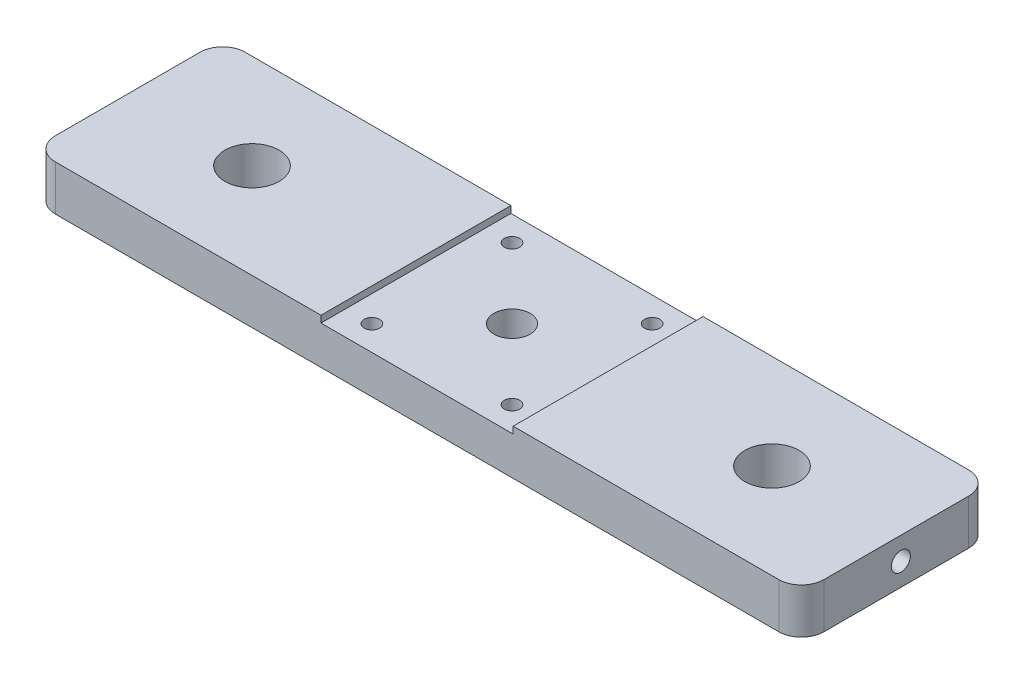
ISO-10303-21;
HEADER;
FILE_DESCRIPTION(('STEP AP214'),'2;1');
FILE_NAME('part.step','',(''),(''),'','','');
FILE_SCHEMA(('AUTOMOTIVE_DESIGN { 1 0 10303 214 1 1 1 1 }'));
ENDSEC;
DATA;
#1=APPLICATION_CONTEXT('core data for automotive mechanical design processes');
#2=APPLICATION_PROTOCOL_DEFINITION('international standard','automotive_design',2000,#1);
#3=PRODUCT_CONTEXT('',#1,'mechanical');
#4=PRODUCT('Part','Part','',(#3));
#5=PRODUCT_RELATED_PRODUCT_CATEGORY('part','',(#4));
#6=PRODUCT_DEFINITION_FORMATION('','',#4);
#7=PRODUCT_DEFINITION_CONTEXT('part definition',#1,'design');
#8=PRODUCT_DEFINITION('design','',#6,#7);
#9=PRODUCT_DEFINITION_SHAPE('','',#8);
#10=(LENGTH_UNIT() NAMED_UNIT(*) SI_UNIT(.MILLI.,.METRE.));
#11=(NAMED_UNIT(*) PLANE_ANGLE_UNIT() SI_UNIT($,.RADIAN.));
#12=(NAMED_UNIT(*) SI_UNIT($,.STERADIAN.) SOLID_ANGLE_UNIT());
#13=UNCERTAINTY_MEASURE_WITH_UNIT(LENGTH_MEASURE(1.E-05),#10,'distance_accuracy_value','');
#14=(GEOMETRIC_REPRESENTATION_CONTEXT(3) GLOBAL_UNCERTAINTY_ASSIGNED_CONTEXT((#13)) GLOBAL_UNIT_ASSIGNED_CONTEXT((#10,
#11,#12)) REPRESENTATION_CONTEXT('',''));
#15=CARTESIAN_POINT('',(0.,0.,0.));
#16=DIRECTION('',(0.,0.,1.));
#17=DIRECTION('',(1.,0.,0.));
#18=AXIS2_PLACEMENT_3D('',#15,#16,#17);
#19=CARTESIAN_POINT('',(0.,10.,0.));
#20=DIRECTION('',(0.,1.,0.));
#21=DIRECTION('',(0.,0.,1.));
#22=AXIS2_PLACEMENT_3D('',#19,#20,#21);
#23=PLANE('',#22);
#24=DIRECTION('',(0.,0.,1.));
#25=VECTOR('',#24,1.);
#26=CARTESIAN_POINT('',(-85.,10.,-21.));
#27=LINE('',#26,#25);
#28=CARTESIAN_POINT('',(-85.,10.,-16.));
#29=VERTEX_POINT('',#28);
#30=CARTESIAN_POINT('',(-85.,10.,16.));
#31=VERTEX_POINT('',#30);
#32=EDGE_CURVE('E176',#29,#31,#27,.T.);
#33=ORIENTED_EDGE('',*,*,#32,.T.);
#34=CARTESIAN_POINT('',(-80.,10.,16.));
#35=DIRECTION('',(0.,1.,0.));
#36=DIRECTION('',(0.,0.,1.));
#37=AXIS2_PLACEMENT_3D('',#34,#35,#36);
#38=CIRCLE('',#37,5.);
#39=CARTESIAN_POINT('',(-80.,10.,21.));
#40=VERTEX_POINT('',#39);
#41=EDGE_CURVE('E242',#31,#40,#38,.T.);
#42=ORIENTED_EDGE('',*,*,#41,.T.);
#43=DIRECTION('',(1.,0.,0.));
#44=VECTOR('',#43,1.);
#45=CARTESIAN_POINT('',(-85.,10.,21.));
#46=LINE('',#45,#44);
#47=CARTESIAN_POINT('',(-21.25,10.,21.));
#48=VERTEX_POINT('',#47);
#49=EDGE_CURVE('E162',#40,#48,#46,.T.);
#50=ORIENTED_EDGE('',*,*,#49,.T.);
#51=DIRECTION('',(0.,0.,1.));
#52=VECTOR('',#51,1.);
#53=CARTESIAN_POINT('',(-21.25,10.,-23.1978282818548));
#54=LINE('',#53,#52);
#55=CARTESIAN_POINT('',(-21.25,10.,-21.));
#56=VERTEX_POINT('',#55);
#57=EDGE_CURVE('E145',#56,#48,#54,.T.);
#58=ORIENTED_EDGE('',*,*,#57,.F.);
#59=DIRECTION('',(-1.,0.,0.));
#60=VECTOR('',#59,1.);
#61=CARTESIAN_POINT('',(-85.,10.,-21.));
#62=LINE('',#61,#60);
#63=CARTESIAN_POINT('',(-80.,10.,-21.));
#64=VERTEX_POINT('',#63);
#65=EDGE_CURVE('E159',#56,#64,#62,.T.);
#66=ORIENTED_EDGE('',*,*,#65,.T.);
#67=CARTESIAN_POINT('',(-80.,10.,-16.));
#68=DIRECTION('',(0.,1.,0.));
#69=DIRECTION('',(0.,0.,1.));
#70=AXIS2_PLACEMENT_3D('',#67,#68,#69);
#71=CIRCLE('',#70,5.);
#72=EDGE_CURVE('E239',#64,#29,#71,.T.);
#73=ORIENTED_EDGE('',*,*,#72,.T.);
#74=EDGE_LOOP('',(#33,#42,#50,#58,#66,#73));
#75=FACE_BOUND('',#74,.T.);
#76=CARTESIAN_POINT('',(-57.5,10.,0.));
#77=DIRECTION('',(0.,1.,0.));
#78=DIRECTION('',(0.,0.,1.));
#79=AXIS2_PLACEMENT_3D('',#76,#77,#78);
#80=CIRCLE('',#79,6.);
#81=CARTESIAN_POINT('',(-57.5,10.,6.));
#82=VERTEX_POINT('',#81);
#83=EDGE_CURVE('E191',#82,#82,#80,.T.);
#84=ORIENTED_EDGE('',*,*,#83,.F.);
#85=EDGE_LOOP('',(#84));
#86=FACE_BOUND('',#85,.T.);
#87=ADVANCED_FACE('F44',(#75,#86),#23,.T.);
#88=CARTESIAN_POINT('',(0.,10.,0.));
#89=DIRECTION('',(0.,-1.,0.));
#90=DIRECTION('',(0.,0.,-1.));
#91=AXIS2_PLACEMENT_3D('',#88,#89,#90);
#92=CYLINDRICAL_SURFACE('',#91,4.);
#93=CARTESIAN_POINT('',(0.,0.,0.));
#94=DIRECTION('',(0.,1.,0.));
#95=DIRECTION('',(0.,0.,1.));
#96=AXIS2_PLACEMENT_3D('',#93,#94,#95);
#97=CIRCLE('',#96,4.);
#98=CARTESIAN_POINT('',(0.,0.,4.));
#99=VERTEX_POINT('',#98);
#100=EDGE_CURVE('E376',#99,#99,#97,.T.);
#101=ORIENTED_EDGE('',*,*,#100,.F.);
#102=EDGE_LOOP('',(#101));
#103=FACE_BOUND('',#102,.T.);
#104=CARTESIAN_POINT('',(0.,8.5,0.));
#105=DIRECTION('',(0.,1.,0.));
#106=DIRECTION('',(0.,0.,1.));
#107=AXIS2_PLACEMENT_3D('',#104,#105,#106);
#108=CIRCLE('',#107,4.);
#109=CARTESIAN_POINT('',(0.,8.5,4.));
#110=VERTEX_POINT('',#109);
#111=EDGE_CURVE('E301',#110,#110,#108,.T.);
#112=ORIENTED_EDGE('',*,*,#111,.T.);
#113=EDGE_LOOP('',(#112));
#114=FACE_BOUND('',#113,.T.);
#115=ADVANCED_FACE('F414',(#103,#114),#92,.F.);
#116=CARTESIAN_POINT('',(-15.5,0.,15.5));
#117=DIRECTION('',(0.,-1.,0.));
#118=DIRECTION('',(0.,0.,-1.));
#119=AXIS2_PLACEMENT_3D('',#116,#117,#118);
#120=CYLINDRICAL_SURFACE('',#119,1.7);
#121=CARTESIAN_POINT('',(-15.5,2.4,15.5));
#122=DIRECTION('',(0.,-1.,0.));
#123=DIRECTION('',(0.,0.,-1.));
#124=AXIS2_PLACEMENT_3D('',#121,#122,#123);
#125=CIRCLE('',#124,1.7);
#126=CARTESIAN_POINT('',(-15.5,2.4,13.8));
#127=VERTEX_POINT('',#126);
#128=EDGE_CURVE('E356',#127,#127,#125,.T.);
#129=ORIENTED_EDGE('',*,*,#128,.T.);
#130=EDGE_LOOP('',(#129));
#131=FACE_BOUND('',#130,.T.);
#132=CARTESIAN_POINT('',(-15.5,8.5,15.5));
#133=DIRECTION('',(0.,1.,0.));
#134=DIRECTION('',(0.,0.,1.));
#135=AXIS2_PLACEMENT_3D('',#132,#133,#134);
#136=CIRCLE('',#135,1.7);
#137=CARTESIAN_POINT('',(-15.5,8.5,17.2));
#138=VERTEX_POINT('',#137);
#139=EDGE_CURVE('E297',#138,#138,#136,.F.);
#140=ORIENTED_EDGE('',*,*,#139,.F.);
#141=EDGE_LOOP('',(#140));
#142=FACE_BOUND('',#141,.T.);
#143=ADVANCED_FACE('F420',(#131,#142),#120,.F.);
#144=CARTESIAN_POINT('',(15.5,0.,15.5));
#145=DIRECTION('',(0.,-1.,0.));
#146=DIRECTION('',(0.,0.,-1.));
#147=AXIS2_PLACEMENT_3D('',#144,#145,#146);
#148=CYLINDRICAL_SURFACE('',#147,1.7);
#149=CARTESIAN_POINT('',(15.5,2.4,15.5));
#150=DIRECTION('',(0.,-1.,0.));
#151=DIRECTION('',(0.,0.,-1.));
#152=AXIS2_PLACEMENT_3D('',#149,#150,#151);
#153=CIRCLE('',#152,1.7);
#154=CARTESIAN_POINT('',(15.5,2.4,13.8));
#155=VERTEX_POINT('',#154);
#156=EDGE_CURVE('E344',#155,#155,#153,.T.);
#157=ORIENTED_EDGE('',*,*,#156,.T.);
#158=EDGE_LOOP('',(#157));
#159=FACE_BOUND('',#158,.T.);
#160=CARTESIAN_POINT('',(15.5,8.5,15.5));
#161=DIRECTION('',(0.,1.,0.));
#162=DIRECTION('',(0.,0.,1.));
#163=AXIS2_PLACEMENT_3D('',#160,#161,#162);
#164=CIRCLE('',#163,1.7);
#165=CARTESIAN_POINT('',(15.5,8.5,17.2));
#166=VERTEX_POINT('',#165);
#167=EDGE_CURVE('E293',#166,#166,#164,.F.);
#168=ORIENTED_EDGE('',*,*,#167,.F.);
#169=EDGE_LOOP('',(#168));
#170=FACE_BOUND('',#169,.T.);
#171=ADVANCED_FACE('F436',(#159,#170),#148,.F.);
#172=CARTESIAN_POINT('',(-15.5,0.,-15.5));
#173=DIRECTION('',(0.,-1.,0.));
#174=DIRECTION('',(0.,0.,-1.));
#175=AXIS2_PLACEMENT_3D('',#172,#173,#174);
#176=CYLINDRICAL_SURFACE('',#175,1.7);
#177=CARTESIAN_POINT('',(-15.5,2.4,-15.5));
#178=DIRECTION('',(0.,-1.,0.));
#179=DIRECTION('',(0.,0.,-1.));
#180=AXIS2_PLACEMENT_3D('',#177,#178,#179);
#181=CIRCLE('',#180,1.7);
#182=CARTESIAN_POINT('',(-15.5,2.4,-17.2));
#183=VERTEX_POINT('',#182);
#184=EDGE_CURVE('E332',#183,#183,#181,.T.);
#185=ORIENTED_EDGE('',*,*,#184,.T.);
#186=EDGE_LOOP('',(#185));
#187=FACE_BOUND('',#186,.T.);
#188=CARTESIAN_POINT('',(-15.5,8.5,-15.5));
#189=DIRECTION('',(0.,1.,0.));
#190=DIRECTION('',(0.,0.,1.));
#191=AXIS2_PLACEMENT_3D('',#188,#189,#190);
#192=CIRCLE('',#191,1.7);
#193=CARTESIAN_POINT('',(-15.5,8.5,-13.8));
#194=VERTEX_POINT('',#193);
#195=EDGE_CURVE('E205',#194,#194,#192,.F.);
#196=ORIENTED_EDGE('',*,*,#195,.F.);
#197=EDGE_LOOP('',(#196));
#198=FACE_BOUND('',#197,.T.);
#199=ADVANCED_FACE('F430',(#187,#198),#176,.F.);
#200=CARTESIAN_POINT('',(15.5,0.,-15.5));
#201=DIRECTION('',(0.,-1.,0.));
#202=DIRECTION('',(0.,0.,-1.));
#203=AXIS2_PLACEMENT_3D('',#200,#201,#202);
#204=CYLINDRICAL_SURFACE('',#203,1.7);
#205=CARTESIAN_POINT('',(15.5,2.4,-15.5));
#206=DIRECTION('',(0.,-1.,0.));
#207=DIRECTION('',(0.,0.,-1.));
#208=AXIS2_PLACEMENT_3D('',#205,#206,#207);
#209=CIRCLE('',#208,1.7);
#210=CARTESIAN_POINT('',(15.5,2.4,-17.2));
#211=VERTEX_POINT('',#210);
#212=EDGE_CURVE('E320',#211,#211,#209,.T.);
#213=ORIENTED_EDGE('',*,*,#212,.T.);
#214=EDGE_LOOP('',(#213));
#215=FACE_BOUND('',#214,.T.);
#216=CARTESIAN_POINT('',(15.5,8.5,-15.5));
#217=DIRECTION('',(0.,1.,0.));
#218=DIRECTION('',(0.,0.,1.));
#219=AXIS2_PLACEMENT_3D('',#216,#217,#218);
#220=CIRCLE('',#219,1.7);
#221=CARTESIAN_POINT('',(15.5,8.5,-13.8));
#222=VERTEX_POINT('',#221);
#223=EDGE_CURVE('E201',#222,#222,#220,.F.);
#224=ORIENTED_EDGE('',*,*,#223,.F.);
#225=EDGE_LOOP('',(#224));
#226=FACE_BOUND('',#225,.T.);
#227=ADVANCED_FACE('F424',(#215,#226),#204,.F.);
#228=DIRECTION('',(0.,0.,-1.));
#229=VECTOR('',#228,1.);
#230=CARTESIAN_POINT('',(85.,10.,-21.));
#231=LINE('',#230,#229);
#232=CARTESIAN_POINT('',(85.,10.,16.));
#233=VERTEX_POINT('',#232);
#234=CARTESIAN_POINT('',(85.,10.,-16.));
#235=VERTEX_POINT('',#234);
#236=EDGE_CURVE('E172',#233,#235,#231,.T.);
#237=ORIENTED_EDGE('',*,*,#236,.T.);
#238=CARTESIAN_POINT('',(80.,10.,-16.));
#239=DIRECTION('',(0.,1.,0.));
#240=DIRECTION('',(0.,0.,1.));
#241=AXIS2_PLACEMENT_3D('',#238,#239,#240);
#242=CIRCLE('',#241,5.);
#243=CARTESIAN_POINT('',(80.,10.,-21.));
#244=VERTEX_POINT('',#243);
#245=EDGE_CURVE('E11',#235,#244,#242,.T.);
#246=ORIENTED_EDGE('',*,*,#245,.T.);
#247=CARTESIAN_POINT('',(21.25,10.,-21.));
#248=VERTEX_POINT('',#247);
#249=EDGE_CURVE('E171',#244,#248,#62,.T.);
#250=ORIENTED_EDGE('',*,*,#249,.T.);
#251=DIRECTION('',(0.,0.,-1.));
#252=VECTOR('',#251,1.);
#253=CARTESIAN_POINT('',(21.25,10.,-23.1978282818548));
#254=LINE('',#253,#252);
#255=CARTESIAN_POINT('',(21.25,10.,21.));
#256=VERTEX_POINT('',#255);
#257=EDGE_CURVE('E164',#256,#248,#254,.T.);
#258=ORIENTED_EDGE('',*,*,#257,.F.);
#259=CARTESIAN_POINT('',(80.,10.,21.));
#260=VERTEX_POINT('',#259);
#261=EDGE_CURVE('E183',#256,#260,#46,.T.);
#262=ORIENTED_EDGE('',*,*,#261,.T.);
#263=CARTESIAN_POINT('',(80.,10.,16.));
#264=DIRECTION('',(0.,1.,0.));
#265=DIRECTION('',(0.,0.,1.));
#266=AXIS2_PLACEMENT_3D('',#263,#264,#265);
#267=CIRCLE('',#266,5.);
#268=EDGE_CURVE('E53',#260,#233,#267,.T.);
#269=ORIENTED_EDGE('',*,*,#268,.T.);
#270=EDGE_LOOP('',(#237,#246,#250,#258,#262,#269));
#271=FACE_BOUND('',#270,.T.);
#272=CARTESIAN_POINT('',(57.5,10.,0.));
#273=DIRECTION('',(0.,1.,0.));
#274=DIRECTION('',(0.,0.,1.));
#275=AXIS2_PLACEMENT_3D('',#272,#273,#274);
#276=CIRCLE('',#275,5.99999999999999);
#277=CARTESIAN_POINT('',(57.5,10.,5.99999999999999));
#278=VERTEX_POINT('',#277);
#279=EDGE_CURVE('E381',#278,#278,#276,.T.);
#280=ORIENTED_EDGE('',*,*,#279,.F.);
#281=EDGE_LOOP('',(#280));
#282=FACE_BOUND('',#281,.T.);
#283=ADVANCED_FACE('F260',(#271,#282),#23,.T.);
#284=CARTESIAN_POINT('',(0.,0.,0.));
#285=DIRECTION('',(0.,1.,0.));
#286=DIRECTION('',(0.,0.,1.));
#287=AXIS2_PLACEMENT_3D('',#284,#285,#286);
#288=PLANE('',#287);
#289=CARTESIAN_POINT('',(15.5,0.,-15.5));
#290=DIRECTION('',(0.,-1.,0.));
#291=DIRECTION('',(0.,0.,-1.));
#292=AXIS2_PLACEMENT_3D('',#289,#290,#291);
#293=CIRCLE('',#292,3.5);
#294=CARTESIAN_POINT('',(15.5,0.,-19.));
#295=VERTEX_POINT('',#294);
#296=EDGE_CURVE('E152',#295,#295,#293,.T.);
#297=ORIENTED_EDGE('',*,*,#296,.F.);
#298=EDGE_LOOP('',(#297));
#299=FACE_BOUND('',#298,.T.);
#300=CARTESIAN_POINT('',(-15.5,0.,-15.5));
#301=DIRECTION('',(0.,-1.,0.));
#302=DIRECTION('',(0.,0.,-1.));
#303=AXIS2_PLACEMENT_3D('',#300,#301,#302);
#304=CIRCLE('',#303,3.5);
#305=CARTESIAN_POINT('',(-15.5,0.,-19.));
#306=VERTEX_POINT('',#305);
#307=EDGE_CURVE('E324',#306,#306,#304,.T.);
#308=ORIENTED_EDGE('',*,*,#307,.F.);
#309=EDGE_LOOP('',(#308));
#310=FACE_BOUND('',#309,.T.);
#311=CARTESIAN_POINT('',(15.5,0.,15.5));
#312=DIRECTION('',(0.,-1.,0.));
#313=DIRECTION('',(0.,0.,-1.));
#314=AXIS2_PLACEMENT_3D('',#311,#312,#313);
#315=CIRCLE('',#314,3.5);
#316=CARTESIAN_POINT('',(15.5,0.,12.));
#317=VERTEX_POINT('',#316);
#318=EDGE_CURVE('E336',#317,#317,#315,.T.);
#319=ORIENTED_EDGE('',*,*,#318,.F.);
#320=EDGE_LOOP('',(#319));
#321=FACE_BOUND('',#320,.T.);
#322=CARTESIAN_POINT('',(-15.5,0.,15.5));
#323=DIRECTION('',(0.,-1.,0.));
#324=DIRECTION('',(0.,0.,-1.));
#325=AXIS2_PLACEMENT_3D('',#322,#323,#324);
#326=CIRCLE('',#325,3.5);
#327=CARTESIAN_POINT('',(-15.5,0.,12.));
#328=VERTEX_POINT('',#327);
#329=EDGE_CURVE('E348',#328,#328,#326,.T.);
#330=ORIENTED_EDGE('',*,*,#329,.F.);
#331=EDGE_LOOP('',(#330));
#332=FACE_BOUND('',#331,.T.);
#333=DIRECTION('',(1.,0.,0.));
#334=VECTOR('',#333,1.);
#335=CARTESIAN_POINT('',(-85.,0.,21.));
#336=LINE('',#335,#334);
#337=CARTESIAN_POINT('',(-80.,0.,21.));
#338=VERTEX_POINT('',#337);
#339=CARTESIAN_POINT('',(80.,0.,21.));
#340=VERTEX_POINT('',#339);
#341=EDGE_CURVE('E177',#338,#340,#336,.T.);
#342=ORIENTED_EDGE('',*,*,#341,.F.);
#343=CARTESIAN_POINT('',(-80.,0.,16.));
#344=DIRECTION('',(0.,1.,0.));
#345=DIRECTION('',(0.,0.,1.));
#346=AXIS2_PLACEMENT_3D('',#343,#344,#345);
#347=CIRCLE('',#346,5.);
#348=CARTESIAN_POINT('',(-85.,0.,16.));
#349=VERTEX_POINT('',#348);
#350=EDGE_CURVE('E229',#338,#349,#347,.F.);
#351=ORIENTED_EDGE('',*,*,#350,.T.);
#352=DIRECTION('',(0.,0.,1.));
#353=VECTOR('',#352,1.);
#354=CARTESIAN_POINT('',(-85.,0.,-21.));
#355=LINE('',#354,#353);
#356=CARTESIAN_POINT('',(-85.,0.,-16.));
#357=VERTEX_POINT('',#356);
#358=EDGE_CURVE('E194',#357,#349,#355,.T.);
#359=ORIENTED_EDGE('',*,*,#358,.F.);
#360=CARTESIAN_POINT('',(-80.,0.,-16.));
#361=DIRECTION('',(0.,1.,0.));
#362=DIRECTION('',(0.,0.,1.));
#363=AXIS2_PLACEMENT_3D('',#360,#361,#362);
#364=CIRCLE('',#363,5.);
#365=CARTESIAN_POINT('',(-80.,0.,-21.));
#366=VERTEX_POINT('',#365);
#367=EDGE_CURVE('E226',#357,#366,#364,.F.);
#368=ORIENTED_EDGE('',*,*,#367,.T.);
#369=DIRECTION('',(-1.,0.,0.));
#370=VECTOR('',#369,1.);
#371=CARTESIAN_POINT('',(-85.,0.,-21.));
#372=LINE('',#371,#370);
#373=CARTESIAN_POINT('',(80.,0.,-21.));
#374=VERTEX_POINT('',#373);
#375=EDGE_CURVE('E190',#374,#366,#372,.T.);
#376=ORIENTED_EDGE('',*,*,#375,.F.);
#377=CARTESIAN_POINT('',(80.,0.,-16.));
#378=DIRECTION('',(0.,1.,0.));
#379=DIRECTION('',(0.,0.,1.));
#380=AXIS2_PLACEMENT_3D('',#377,#378,#379);
#381=CIRCLE('',#380,5.);
#382=CARTESIAN_POINT('',(85.,0.,-16.));
#383=VERTEX_POINT('',#382);
#384=EDGE_CURVE('E223',#374,#383,#381,.F.);
#385=ORIENTED_EDGE('',*,*,#384,.T.);
#386=DIRECTION('',(0.,0.,-1.));
#387=VECTOR('',#386,1.);
#388=CARTESIAN_POINT('',(85.,0.,-21.));
#389=LINE('',#388,#387);
#390=CARTESIAN_POINT('',(85.,0.,16.));
#391=VERTEX_POINT('',#390);
#392=EDGE_CURVE('E187',#391,#383,#389,.T.);
#393=ORIENTED_EDGE('',*,*,#392,.F.);
#394=CARTESIAN_POINT('',(80.,0.,16.));
#395=DIRECTION('',(0.,1.,0.));
#396=DIRECTION('',(0.,0.,1.));
#397=AXIS2_PLACEMENT_3D('',#394,#395,#396);
#398=CIRCLE('',#397,5.);
#399=EDGE_CURVE('E220',#391,#340,#398,.F.);
#400=ORIENTED_EDGE('',*,*,#399,.T.);
#401=EDGE_LOOP('',(#342,#351,#359,#368,#376,#385,#393,#400));
#402=FACE_BOUND('',#401,.T.);
#403=CARTESIAN_POINT('',(-57.5,0.,0.));
#404=DIRECTION('',(0.,1.,0.));
#405=DIRECTION('',(0.,0.,1.));
#406=AXIS2_PLACEMENT_3D('',#403,#404,#405);
#407=CIRCLE('',#406,6.);
#408=CARTESIAN_POINT('',(-57.5,0.,6.));
#409=VERTEX_POINT('',#408);
#410=EDGE_CURVE('E385',#409,#409,#407,.T.);
#411=ORIENTED_EDGE('',*,*,#410,.T.);
#412=EDGE_LOOP('',(#411));
#413=FACE_BOUND('',#412,.T.);
#414=CARTESIAN_POINT('',(57.5,0.,0.));
#415=DIRECTION('',(0.,1.,0.));
#416=DIRECTION('',(0.,0.,1.));
#417=AXIS2_PLACEMENT_3D('',#414,#415,#416);
#418=CIRCLE('',#417,5.99999999999999);
#419=CARTESIAN_POINT('',(57.5,0.,5.99999999999999));
#420=VERTEX_POINT('',#419);
#421=EDGE_CURVE('E380',#420,#420,#418,.T.);
#422=ORIENTED_EDGE('',*,*,#421,.T.);
#423=EDGE_LOOP('',(#422));
#424=FACE_BOUND('',#423,.T.);
#425=ORIENTED_EDGE('',*,*,#100,.T.);
#426=EDGE_LOOP('',(#425));
#427=FACE_BOUND('',#426,.T.);
#428=ADVANCED_FACE('F271',(#299,#310,#321,#332,#402,#413,#424,#427),#288,.F.);
#429=CARTESIAN_POINT('',(85.,10.,-21.));
#430=DIRECTION('',(-1.,0.,0.));
#431=DIRECTION('',(0.,0.,1.));
#432=AXIS2_PLACEMENT_3D('',#429,#430,#431);
#433=PLANE('',#432);
#434=CARTESIAN_POINT('',(85.,5.,-1.00000000000001));
#435=DIRECTION('',(1.,0.,0.));
#436=DIRECTION('',(0.,0.,-1.));
#437=AXIS2_PLACEMENT_3D('',#434,#435,#436);
#438=CIRCLE('',#437,2.1);
#439=CARTESIAN_POINT('',(85.,5.,-3.10000000000001));
#440=VERTEX_POINT('',#439);
#441=EDGE_CURVE('E368',#440,#440,#438,.T.);
#442=ORIENTED_EDGE('',*,*,#441,.F.);
#443=EDGE_LOOP('',(#442));
#444=FACE_BOUND('',#443,.T.);
#445=ORIENTED_EDGE('',*,*,#392,.T.);
#446=DIRECTION('',(0.,-1.,0.));
#447=VECTOR('',#446,1.);
#448=CARTESIAN_POINT('',(85.,10.,-16.));
#449=LINE('',#448,#447);
#450=EDGE_CURVE('E60',#383,#235,#449,.F.);
#451=ORIENTED_EDGE('',*,*,#450,.T.);
#452=ORIENTED_EDGE('',*,*,#236,.F.);
#453=DIRECTION('',(0.,-1.,0.));
#454=VECTOR('',#453,1.);
#455=CARTESIAN_POINT('',(85.,10.,16.));
#456=LINE('',#455,#454);
#457=EDGE_CURVE('E251',#233,#391,#456,.T.);
#458=ORIENTED_EDGE('',*,*,#457,.T.);
#459=EDGE_LOOP('',(#445,#451,#452,#458));
#460=FACE_BOUND('',#459,.T.);
#461=ADVANCED_FACE('F268',(#444,#460),#433,.F.);
#462=CARTESIAN_POINT('',(-85.,10.,-21.));
#463=DIRECTION('',(0.,0.,1.));
#464=DIRECTION('',(1.,0.,0.));
#465=AXIS2_PLACEMENT_3D('',#462,#463,#464);
#466=PLANE('',#465);
#467=ORIENTED_EDGE('',*,*,#375,.T.);
#468=DIRECTION('',(0.,-1.,0.));
#469=VECTOR('',#468,1.);
#470=CARTESIAN_POINT('',(-80.,10.,-21.));
#471=LINE('',#470,#469);
#472=EDGE_CURVE('E169',#366,#64,#471,.F.);
#473=ORIENTED_EDGE('',*,*,#472,.T.);
#474=ORIENTED_EDGE('',*,*,#65,.F.);
#475=DIRECTION('',(0.,-1.,0.));
#476=VECTOR('',#475,1.);
#477=CARTESIAN_POINT('',(-21.25,10.,-21.));
#478=LINE('',#477,#476);
#479=CARTESIAN_POINT('',(-21.25,8.5,-21.));
#480=VERTEX_POINT('',#479);
#481=EDGE_CURVE('E141',#56,#480,#478,.T.);
#482=ORIENTED_EDGE('',*,*,#481,.T.);
#483=DIRECTION('',(-1.,0.,0.));
#484=VECTOR('',#483,1.);
#485=CARTESIAN_POINT('',(-85.,8.5,-21.));
#486=LINE('',#485,#484);
#487=CARTESIAN_POINT('',(21.25,8.5,-21.));
#488=VERTEX_POINT('',#487);
#489=EDGE_CURVE('E308',#488,#480,#486,.T.);
#490=ORIENTED_EDGE('',*,*,#489,.F.);
#491=DIRECTION('',(0.,1.,0.));
#492=VECTOR('',#491,1.);
#493=CARTESIAN_POINT('',(21.25,10.,-21.));
#494=LINE('',#493,#492);
#495=EDGE_CURVE('E153',#488,#248,#494,.T.);
#496=ORIENTED_EDGE('',*,*,#495,.T.);
#497=ORIENTED_EDGE('',*,*,#249,.F.);
#498=DIRECTION('',(0.,-1.,0.));
#499=VECTOR('',#498,1.);
#500=CARTESIAN_POINT('',(80.,10.,-21.));
#501=LINE('',#500,#499);
#502=EDGE_CURVE('E245',#244,#374,#501,.T.);
#503=ORIENTED_EDGE('',*,*,#502,.T.);
#504=EDGE_LOOP('',(#467,#473,#474,#482,#490,#496,#497,#503));
#505=FACE_BOUND('',#504,.T.);
#506=ADVANCED_FACE('F167',(#505),#466,.F.);
#507=CARTESIAN_POINT('',(-85.,10.,-21.));
#508=DIRECTION('',(1.,0.,0.));
#509=DIRECTION('',(0.,0.,-1.));
#510=AXIS2_PLACEMENT_3D('',#507,#508,#509);
#511=PLANE('',#510);
#512=CARTESIAN_POINT('',(-85.,5.,-1.00000000000001));
#513=DIRECTION('',(-1.,0.,0.));
#514=DIRECTION('',(0.,0.,1.));
#515=AXIS2_PLACEMENT_3D('',#512,#513,#514);
#516=CIRCLE('',#515,2.1);
#517=CARTESIAN_POINT('',(-85.,5.,1.09999999999999));
#518=VERTEX_POINT('',#517);
#519=EDGE_CURVE('E360',#518,#518,#516,.T.);
#520=ORIENTED_EDGE('',*,*,#519,.F.);
#521=EDGE_LOOP('',(#520));
#522=FACE_BOUND('',#521,.T.);
#523=ORIENTED_EDGE('',*,*,#358,.T.);
#524=DIRECTION('',(0.,-1.,0.));
#525=VECTOR('',#524,1.);
#526=CARTESIAN_POINT('',(-85.,10.,16.));
#527=LINE('',#526,#525);
#528=EDGE_CURVE('E236',#349,#31,#527,.F.);
#529=ORIENTED_EDGE('',*,*,#528,.T.);
#530=ORIENTED_EDGE('',*,*,#32,.F.);
#531=DIRECTION('',(0.,-1.,0.));
#532=VECTOR('',#531,1.);
#533=CARTESIAN_POINT('',(-85.,10.,-16.));
#534=LINE('',#533,#532);
#535=EDGE_CURVE('E232',#29,#357,#534,.T.);
#536=ORIENTED_EDGE('',*,*,#535,.T.);
#537=EDGE_LOOP('',(#523,#529,#530,#536));
#538=FACE_BOUND('',#537,.T.);
#539=ADVANCED_FACE('F410',(#522,#538),#511,.F.);
#540=CARTESIAN_POINT('',(-85.,10.,21.));
#541=DIRECTION('',(0.,0.,-1.));
#542=DIRECTION('',(-1.,0.,0.));
#543=AXIS2_PLACEMENT_3D('',#540,#541,#542);
#544=PLANE('',#543);
#545=ORIENTED_EDGE('',*,*,#49,.F.);
#546=DIRECTION('',(0.,-1.,0.));
#547=VECTOR('',#546,1.);
#548=CARTESIAN_POINT('',(-80.,10.,21.));
#549=LINE('',#548,#547);
#550=EDGE_CURVE('E216',#40,#338,#549,.T.);
#551=ORIENTED_EDGE('',*,*,#550,.T.);
#552=ORIENTED_EDGE('',*,*,#341,.T.);
#553=DIRECTION('',(0.,-1.,0.));
#554=VECTOR('',#553,1.);
#555=CARTESIAN_POINT('',(80.,10.,21.));
#556=LINE('',#555,#554);
#557=EDGE_CURVE('E213',#340,#260,#556,.F.);
#558=ORIENTED_EDGE('',*,*,#557,.T.);
#559=ORIENTED_EDGE('',*,*,#261,.F.);
#560=DIRECTION('',(0.,-1.,0.));
#561=VECTOR('',#560,1.);
#562=CARTESIAN_POINT('',(21.25,10.,21.));
#563=LINE('',#562,#561);
#564=CARTESIAN_POINT('',(21.25,8.5,21.));
#565=VERTEX_POINT('',#564);
#566=EDGE_CURVE('E186',#256,#565,#563,.T.);
#567=ORIENTED_EDGE('',*,*,#566,.T.);
#568=DIRECTION('',(1.,0.,0.));
#569=VECTOR('',#568,1.);
#570=CARTESIAN_POINT('',(-85.,8.5,21.));
#571=LINE('',#570,#569);
#572=CARTESIAN_POINT('',(-21.25,8.5,21.));
#573=VERTEX_POINT('',#572);
#574=EDGE_CURVE('E305',#573,#565,#571,.T.);
#575=ORIENTED_EDGE('',*,*,#574,.F.);
#576=DIRECTION('',(0.,1.,0.));
#577=VECTOR('',#576,1.);
#578=CARTESIAN_POINT('',(-21.25,10.,21.));
#579=LINE('',#578,#577);
#580=EDGE_CURVE('E210',#573,#48,#579,.T.);
#581=ORIENTED_EDGE('',*,*,#580,.T.);
#582=EDGE_LOOP('',(#545,#551,#552,#558,#559,#567,#575,#581));
#583=FACE_BOUND('',#582,.T.);
#584=ADVANCED_FACE('F399',(#583),#544,.F.);
#585=CARTESIAN_POINT('',(-57.5,10.,0.));
#586=DIRECTION('',(0.,-1.,0.));
#587=DIRECTION('',(0.,0.,-1.));
#588=AXIS2_PLACEMENT_3D('',#585,#586,#587);
#589=CYLINDRICAL_SURFACE('',#588,6.);
#590=ORIENTED_EDGE('',*,*,#83,.T.);
#591=EDGE_LOOP('',(#590));
#592=FACE_BOUND('',#591,.T.);
#593=ORIENTED_EDGE('',*,*,#410,.F.);
#594=EDGE_LOOP('',(#593));
#595=FACE_BOUND('',#594,.T.);
#596=ADVANCED_FACE('F396',(#592,#595),#589,.F.);
#597=CARTESIAN_POINT('',(57.5,10.,0.));
#598=DIRECTION('',(0.,-1.,0.));
#599=DIRECTION('',(0.,0.,-1.));
#600=AXIS2_PLACEMENT_3D('',#597,#598,#599);
#601=CYLINDRICAL_SURFACE('',#600,5.99999999999999);
#602=ORIENTED_EDGE('',*,*,#279,.T.);
#603=EDGE_LOOP('',(#602));
#604=FACE_BOUND('',#603,.T.);
#605=ORIENTED_EDGE('',*,*,#421,.F.);
#606=EDGE_LOOP('',(#605));
#607=FACE_BOUND('',#606,.T.);
#608=ADVANCED_FACE('F398',(#604,#607),#601,.F.);
#609=CARTESIAN_POINT('',(71.,5.,-1.00000000000001));
#610=DIRECTION('',(1.,0.,0.));
#611=DIRECTION('',(0.,0.,-1.));
#612=AXIS2_PLACEMENT_3D('',#609,#610,#611);
#613=CONICAL_SURFACE('',#612,2.1,1.02974425867665);
#614=CARTESIAN_POINT('',(69.7381927000421,5.,-1.00000000000001));
#615=VERTEX_POINT('',#614);
#616=VERTEX_LOOP('',#615);
#617=FACE_BOUND('',#616,.T.);
#618=CARTESIAN_POINT('',(71.,5.,-1.00000000000001));
#619=DIRECTION('',(1.,0.,0.));
#620=DIRECTION('',(0.,0.,-1.));
#621=AXIS2_PLACEMENT_3D('',#618,#619,#620);
#622=CIRCLE('',#621,2.1);
#623=CARTESIAN_POINT('',(71.,5.,-3.1));
#624=VERTEX_POINT('',#623);
#625=EDGE_CURVE('E372',#624,#624,#622,.T.);
#626=ORIENTED_EDGE('',*,*,#625,.T.);
#627=EDGE_LOOP('',(#626));
#628=FACE_BOUND('',#627,.T.);
#629=ADVANCED_FACE('F406',(#617,#628),#613,.F.);
#630=CARTESIAN_POINT('',(85.,5.,-1.00000000000001));
#631=DIRECTION('',(1.,0.,0.));
#632=DIRECTION('',(0.,0.,-1.));
#633=AXIS2_PLACEMENT_3D('',#630,#631,#632);
#634=CYLINDRICAL_SURFACE('',#633,2.1);
#635=ORIENTED_EDGE('',*,*,#625,.F.);
#636=EDGE_LOOP('',(#635));
#637=FACE_BOUND('',#636,.T.);
#638=ORIENTED_EDGE('',*,*,#441,.T.);
#639=EDGE_LOOP('',(#638));
#640=FACE_BOUND('',#639,.T.);
#641=ADVANCED_FACE('F481',(#637,#640),#634,.F.);
#642=CARTESIAN_POINT('',(-71.,5.,-1.00000000000001));
#643=DIRECTION('',(-1.,0.,0.));
#644=DIRECTION('',(0.,0.,1.));
#645=AXIS2_PLACEMENT_3D('',#642,#643,#644);
#646=CONICAL_SURFACE('',#645,2.1,1.02974425867665);
#647=CARTESIAN_POINT('',(-69.7381927000421,5.,-1.00000000000001));
#648=VERTEX_POINT('',#647);
#649=VERTEX_LOOP('',#648);
#650=FACE_BOUND('',#649,.T.);
#651=CARTESIAN_POINT('',(-71.,5.,-1.00000000000001));
#652=DIRECTION('',(-1.,0.,0.));
#653=DIRECTION('',(0.,0.,1.));
#654=AXIS2_PLACEMENT_3D('',#651,#652,#653);
#655=CIRCLE('',#654,2.1);
#656=CARTESIAN_POINT('',(-71.,5.,1.09999999999999));
#657=VERTEX_POINT('',#656);
#658=EDGE_CURVE('E364',#657,#657,#655,.T.);
#659=ORIENTED_EDGE('',*,*,#658,.T.);
#660=EDGE_LOOP('',(#659));
#661=FACE_BOUND('',#660,.T.);
#662=ADVANCED_FACE('F477',(#650,#661),#646,.F.);
#663=CARTESIAN_POINT('',(-85.,5.,-1.00000000000001));
#664=DIRECTION('',(-1.,0.,0.));
#665=DIRECTION('',(0.,0.,1.));
#666=AXIS2_PLACEMENT_3D('',#663,#664,#665);
#667=CYLINDRICAL_SURFACE('',#666,2.1);
#668=ORIENTED_EDGE('',*,*,#658,.F.);
#669=EDGE_LOOP('',(#668));
#670=FACE_BOUND('',#669,.T.);
#671=ORIENTED_EDGE('',*,*,#519,.T.);
#672=EDGE_LOOP('',(#671));
#673=FACE_BOUND('',#672,.T.);
#674=ADVANCED_FACE('F470',(#670,#673),#667,.F.);
#675=CARTESIAN_POINT('',(-13.8,2.4,15.5));
#676=DIRECTION('',(0.,1.,0.));
#677=DIRECTION('',(0.,0.,1.));
#678=AXIS2_PLACEMENT_3D('',#675,#676,#677);
#679=PLANE('',#678);
#680=ORIENTED_EDGE('',*,*,#128,.F.);
#681=EDGE_LOOP('',(#680));
#682=FACE_BOUND('',#681,.T.);
#683=CARTESIAN_POINT('',(-15.5,2.4,15.5));
#684=DIRECTION('',(0.,-1.,0.));
#685=DIRECTION('',(0.,0.,-1.));
#686=AXIS2_PLACEMENT_3D('',#683,#684,#685);
#687=CIRCLE('',#686,3.5);
#688=CARTESIAN_POINT('',(-15.5,2.4,12.));
#689=VERTEX_POINT('',#688);
#690=EDGE_CURVE('E352',#689,#689,#687,.T.);
#691=ORIENTED_EDGE('',*,*,#690,.T.);
#692=EDGE_LOOP('',(#691));
#693=FACE_BOUND('',#692,.T.);
#694=ADVANCED_FACE('F466',(#682,#693),#679,.F.);
#695=CARTESIAN_POINT('',(-15.5,0.,15.5));
#696=DIRECTION('',(0.,-1.,0.));
#697=DIRECTION('',(0.,0.,-1.));
#698=AXIS2_PLACEMENT_3D('',#695,#696,#697);
#699=CYLINDRICAL_SURFACE('',#698,3.5);
#700=ORIENTED_EDGE('',*,*,#690,.F.);
#701=EDGE_LOOP('',(#700));
#702=FACE_BOUND('',#701,.T.);
#703=ORIENTED_EDGE('',*,*,#329,.T.);
#704=EDGE_LOOP('',(#703));
#705=FACE_BOUND('',#704,.T.);
#706=ADVANCED_FACE('F459',(#702,#705),#699,.F.);
#707=CARTESIAN_POINT('',(17.2,2.4,15.5));
#708=DIRECTION('',(0.,1.,0.));
#709=DIRECTION('',(0.,0.,1.));
#710=AXIS2_PLACEMENT_3D('',#707,#708,#709);
#711=PLANE('',#710);
#712=ORIENTED_EDGE('',*,*,#156,.F.);
#713=EDGE_LOOP('',(#712));
#714=FACE_BOUND('',#713,.T.);
#715=CARTESIAN_POINT('',(15.5,2.4,15.5));
#716=DIRECTION('',(0.,-1.,0.));
#717=DIRECTION('',(0.,0.,-1.));
#718=AXIS2_PLACEMENT_3D('',#715,#716,#717);
#719=CIRCLE('',#718,3.5);
#720=CARTESIAN_POINT('',(15.5,2.4,12.));
#721=VERTEX_POINT('',#720);
#722=EDGE_CURVE('E340',#721,#721,#719,.T.);
#723=ORIENTED_EDGE('',*,*,#722,.T.);
#724=EDGE_LOOP('',(#723));
#725=FACE_BOUND('',#724,.T.);
#726=ADVANCED_FACE('F455',(#714,#725),#711,.F.);
#727=CARTESIAN_POINT('',(15.5,0.,15.5));
#728=DIRECTION('',(0.,-1.,0.));
#729=DIRECTION('',(0.,0.,-1.));
#730=AXIS2_PLACEMENT_3D('',#727,#728,#729);
#731=CYLINDRICAL_SURFACE('',#730,3.5);
#732=ORIENTED_EDGE('',*,*,#722,.F.);
#733=EDGE_LOOP('',(#732));
#734=FACE_BOUND('',#733,.T.);
#735=ORIENTED_EDGE('',*,*,#318,.T.);
#736=EDGE_LOOP('',(#735));
#737=FACE_BOUND('',#736,.T.);
#738=ADVANCED_FACE('F450',(#734,#737),#731,.F.);
#739=CARTESIAN_POINT('',(-13.8,2.4,-15.5));
#740=DIRECTION('',(0.,1.,0.));
#741=DIRECTION('',(0.,0.,1.));
#742=AXIS2_PLACEMENT_3D('',#739,#740,#741);
#743=PLANE('',#742);
#744=ORIENTED_EDGE('',*,*,#184,.F.);
#745=EDGE_LOOP('',(#744));
#746=FACE_BOUND('',#745,.T.);
#747=CARTESIAN_POINT('',(-15.5,2.4,-15.5));
#748=DIRECTION('',(0.,-1.,0.));
#749=DIRECTION('',(0.,0.,-1.));
#750=AXIS2_PLACEMENT_3D('',#747,#748,#749);
#751=CIRCLE('',#750,3.5);
#752=CARTESIAN_POINT('',(-15.5,2.4,-19.));
#753=VERTEX_POINT('',#752);
#754=EDGE_CURVE('E328',#753,#753,#751,.T.);
#755=ORIENTED_EDGE('',*,*,#754,.T.);
#756=EDGE_LOOP('',(#755));
#757=FACE_BOUND('',#756,.T.);
#758=ADVANCED_FACE('F447',(#746,#757),#743,.F.);
#759=CARTESIAN_POINT('',(-15.5,0.,-15.5));
#760=DIRECTION('',(0.,-1.,0.));
#761=DIRECTION('',(0.,0.,-1.));
#762=AXIS2_PLACEMENT_3D('',#759,#760,#761);
#763=CYLINDRICAL_SURFACE('',#762,3.5);
#764=ORIENTED_EDGE('',*,*,#754,.F.);
#765=EDGE_LOOP('',(#764));
#766=FACE_BOUND('',#765,.T.);
#767=ORIENTED_EDGE('',*,*,#307,.T.);
#768=EDGE_LOOP('',(#767));
#769=FACE_BOUND('',#768,.T.);
#770=ADVANCED_FACE('F444',(#766,#769),#763,.F.);
#771=CARTESIAN_POINT('',(17.2,2.4,-15.5));
#772=DIRECTION('',(0.,1.,0.));
#773=DIRECTION('',(0.,0.,1.));
#774=AXIS2_PLACEMENT_3D('',#771,#772,#773);
#775=PLANE('',#774);
#776=ORIENTED_EDGE('',*,*,#212,.F.);
#777=EDGE_LOOP('',(#776));
#778=FACE_BOUND('',#777,.T.);
#779=CARTESIAN_POINT('',(15.5,2.4,-15.5));
#780=DIRECTION('',(0.,-1.,0.));
#781=DIRECTION('',(0.,0.,-1.));
#782=AXIS2_PLACEMENT_3D('',#779,#780,#781);
#783=CIRCLE('',#782,3.5);
#784=CARTESIAN_POINT('',(15.5,2.4,-19.));
#785=VERTEX_POINT('',#784);
#786=EDGE_CURVE('E316',#785,#785,#783,.T.);
#787=ORIENTED_EDGE('',*,*,#786,.T.);
#788=EDGE_LOOP('',(#787));
#789=FACE_BOUND('',#788,.T.);
#790=ADVANCED_FACE('F442',(#778,#789),#775,.F.);
#791=CARTESIAN_POINT('',(15.5,0.,-15.5));
#792=DIRECTION('',(0.,-1.,0.));
#793=DIRECTION('',(0.,0.,-1.));
#794=AXIS2_PLACEMENT_3D('',#791,#792,#793);
#795=CYLINDRICAL_SURFACE('',#794,3.5);
#796=ORIENTED_EDGE('',*,*,#786,.F.);
#797=EDGE_LOOP('',(#796));
#798=FACE_BOUND('',#797,.T.);
#799=ORIENTED_EDGE('',*,*,#296,.T.);
#800=EDGE_LOOP('',(#799));
#801=FACE_BOUND('',#800,.T.);
#802=ADVANCED_FACE('F638',(#798,#801),#795,.F.);
#803=CARTESIAN_POINT('',(-21.25,8.5,-23.1978282818548));
#804=DIRECTION('',(-1.,0.,0.));
#805=DIRECTION('',(0.,0.,1.));
#806=AXIS2_PLACEMENT_3D('',#803,#804,#805);
#807=PLANE('',#806);
#808=ORIENTED_EDGE('',*,*,#57,.T.);
#809=ORIENTED_EDGE('',*,*,#580,.F.);
#810=DIRECTION('',(0.,0.,1.));
#811=VECTOR('',#810,1.);
#812=CARTESIAN_POINT('',(-21.25,8.5,-23.1978282818548));
#813=LINE('',#812,#811);
#814=EDGE_CURVE('E147',#480,#573,#813,.T.);
#815=ORIENTED_EDGE('',*,*,#814,.F.);
#816=ORIENTED_EDGE('',*,*,#481,.F.);
#817=EDGE_LOOP('',(#808,#809,#815,#816));
#818=FACE_BOUND('',#817,.T.);
#819=ADVANCED_FACE('F143',(#818),#807,.F.);
#820=CARTESIAN_POINT('',(21.25,8.5,-23.1978282818548));
#821=DIRECTION('',(1.,0.,0.));
#822=DIRECTION('',(0.,0.,-1.));
#823=AXIS2_PLACEMENT_3D('',#820,#821,#822);
#824=PLANE('',#823);
#825=DIRECTION('',(0.,0.,-1.));
#826=VECTOR('',#825,1.);
#827=CARTESIAN_POINT('',(21.25,8.5,-23.1978282818548));
#828=LINE('',#827,#826);
#829=EDGE_CURVE('E206',#565,#488,#828,.T.);
#830=ORIENTED_EDGE('',*,*,#829,.F.);
#831=ORIENTED_EDGE('',*,*,#566,.F.);
#832=ORIENTED_EDGE('',*,*,#257,.T.);
#833=ORIENTED_EDGE('',*,*,#495,.F.);
#834=EDGE_LOOP('',(#830,#831,#832,#833));
#835=FACE_BOUND('',#834,.T.);
#836=ADVANCED_FACE('F282',(#835),#824,.F.);
#837=CARTESIAN_POINT('',(0.,8.5,0.));
#838=DIRECTION('',(0.,1.,0.));
#839=DIRECTION('',(0.,0.,1.));
#840=AXIS2_PLACEMENT_3D('',#837,#838,#839);
#841=PLANE('',#840);
#842=ORIENTED_EDGE('',*,*,#111,.F.);
#843=EDGE_LOOP('',(#842));
#844=FACE_BOUND('',#843,.T.);
#845=ORIENTED_EDGE('',*,*,#223,.T.);
#846=EDGE_LOOP('',(#845));
#847=FACE_BOUND('',#846,.T.);
#848=ORIENTED_EDGE('',*,*,#195,.T.);
#849=EDGE_LOOP('',(#848));
#850=FACE_BOUND('',#849,.T.);
#851=ORIENTED_EDGE('',*,*,#167,.T.);
#852=EDGE_LOOP('',(#851));
#853=FACE_BOUND('',#852,.T.);
#854=ORIENTED_EDGE('',*,*,#139,.T.);
#855=EDGE_LOOP('',(#854));
#856=FACE_BOUND('',#855,.T.);
#857=ORIENTED_EDGE('',*,*,#489,.T.);
#858=ORIENTED_EDGE('',*,*,#814,.T.);
#859=ORIENTED_EDGE('',*,*,#574,.T.);
#860=ORIENTED_EDGE('',*,*,#829,.T.);
#861=EDGE_LOOP('',(#857,#858,#859,#860));
#862=FACE_BOUND('',#861,.T.);
#863=ADVANCED_FACE('F507',(#844,#847,#850,#853,#856,#862),#841,.T.);
#864=CARTESIAN_POINT('',(-80.,10.,16.));
#865=DIRECTION('',(0.,-1.,0.));
#866=DIRECTION('',(0.,0.,-1.));
#867=AXIS2_PLACEMENT_3D('',#864,#865,#866);
#868=CYLINDRICAL_SURFACE('',#867,5.);
#869=ORIENTED_EDGE('',*,*,#41,.F.);
#870=ORIENTED_EDGE('',*,*,#528,.F.);
#871=ORIENTED_EDGE('',*,*,#350,.F.);
#872=ORIENTED_EDGE('',*,*,#550,.F.);
#873=EDGE_LOOP('',(#869,#870,#871,#872));
#874=FACE_BOUND('',#873,.T.);
#875=ADVANCED_FACE('F503',(#874),#868,.T.);
#876=CARTESIAN_POINT('',(-80.,10.,-16.));
#877=DIRECTION('',(0.,-1.,0.));
#878=DIRECTION('',(0.,0.,-1.));
#879=AXIS2_PLACEMENT_3D('',#876,#877,#878);
#880=CYLINDRICAL_SURFACE('',#879,5.);
#881=ORIENTED_EDGE('',*,*,#72,.F.);
#882=ORIENTED_EDGE('',*,*,#472,.F.);
#883=ORIENTED_EDGE('',*,*,#367,.F.);
#884=ORIENTED_EDGE('',*,*,#535,.F.);
#885=EDGE_LOOP('',(#881,#882,#883,#884));
#886=FACE_BOUND('',#885,.T.);
#887=ADVANCED_FACE('F506',(#886),#880,.T.);
#888=CARTESIAN_POINT('',(80.,10.,-16.));
#889=DIRECTION('',(0.,-1.,0.));
#890=DIRECTION('',(0.,0.,-1.));
#891=AXIS2_PLACEMENT_3D('',#888,#889,#890);
#892=CYLINDRICAL_SURFACE('',#891,5.);
#893=ORIENTED_EDGE('',*,*,#245,.F.);
#894=ORIENTED_EDGE('',*,*,#450,.F.);
#895=ORIENTED_EDGE('',*,*,#384,.F.);
#896=ORIENTED_EDGE('',*,*,#502,.F.);
#897=EDGE_LOOP('',(#893,#894,#895,#896));
#898=FACE_BOUND('',#897,.T.);
#899=ADVANCED_FACE('F277',(#898),#892,.T.);
#900=CARTESIAN_POINT('',(80.,10.,16.));
#901=DIRECTION('',(0.,-1.,0.));
#902=DIRECTION('',(0.,0.,-1.));
#903=AXIS2_PLACEMENT_3D('',#900,#901,#902);
#904=CYLINDRICAL_SURFACE('',#903,5.);
#905=ORIENTED_EDGE('',*,*,#268,.F.);
#906=ORIENTED_EDGE('',*,*,#557,.F.);
#907=ORIENTED_EDGE('',*,*,#399,.F.);
#908=ORIENTED_EDGE('',*,*,#457,.F.);
#909=EDGE_LOOP('',(#905,#906,#907,#908));
#910=FACE_BOUND('',#909,.T.);
#911=ADVANCED_FACE('F46',(#910),#904,.T.);
#912=CLOSED_SHELL('',(#87,#115,#143,#171,#199,#227,#283,#428,#461,#506,#539,#584,#596,#608,#629,
#641,#662,#674,#694,#706,#726,#738,#758,#770,#790,#802,#819,#836,#863,#875,#887,#899,#911));
#913=MANIFOLD_SOLID_BREP('B2',#912);
#914=ADVANCED_BREP_SHAPE_REPRESENTATION('',(#18,#913),#14);
#915=SHAPE_DEFINITION_REPRESENTATION(#9,#914);
ENDSEC;
END-ISO-10303-21;
